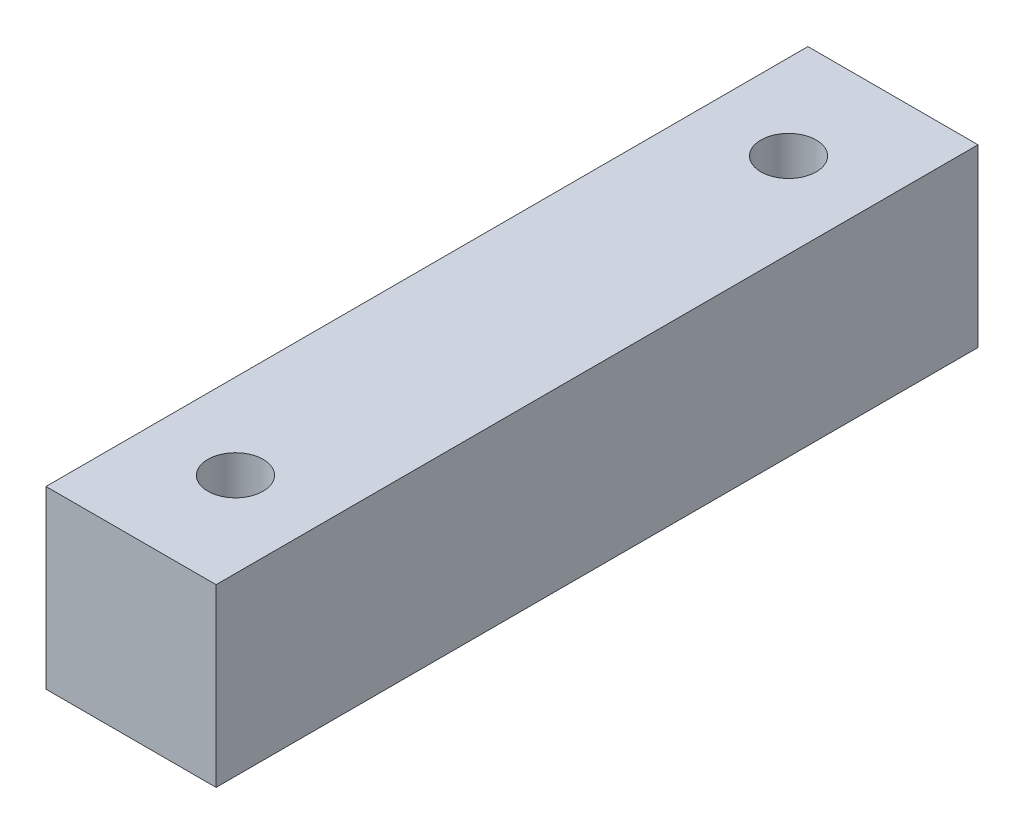
ISO-10303-21;
HEADER;
FILE_DESCRIPTION(('STEP AP214'),'2;1');
FILE_NAME('part.step','',(''),(''),'','','');
FILE_SCHEMA(('AUTOMOTIVE_DESIGN { 1 0 10303 214 1 1 1 1 }'));
ENDSEC;
DATA;
#1=APPLICATION_CONTEXT('core data for automotive mechanical design processes');
#2=APPLICATION_PROTOCOL_DEFINITION('international standard','automotive_design',2000,#1);
#3=PRODUCT_CONTEXT('',#1,'mechanical');
#4=PRODUCT('Part','Part','',(#3));
#5=PRODUCT_RELATED_PRODUCT_CATEGORY('part','',(#4));
#6=PRODUCT_DEFINITION_FORMATION('','',#4);
#7=PRODUCT_DEFINITION_CONTEXT('part definition',#1,'design');
#8=PRODUCT_DEFINITION('design','',#6,#7);
#9=PRODUCT_DEFINITION_SHAPE('','',#8);
#10=(LENGTH_UNIT() NAMED_UNIT(*) SI_UNIT(.MILLI.,.METRE.));
#11=(NAMED_UNIT(*) PLANE_ANGLE_UNIT() SI_UNIT($,.RADIAN.));
#12=(NAMED_UNIT(*) SI_UNIT($,.STERADIAN.) SOLID_ANGLE_UNIT());
#13=UNCERTAINTY_MEASURE_WITH_UNIT(LENGTH_MEASURE(1.E-05),#10,'distance_accuracy_value','');
#14=(GEOMETRIC_REPRESENTATION_CONTEXT(3) GLOBAL_UNCERTAINTY_ASSIGNED_CONTEXT((#13)) GLOBAL_UNIT_ASSIGNED_CONTEXT((#10,
#11,#12)) REPRESENTATION_CONTEXT('',''));
#15=CARTESIAN_POINT('',(0.,0.,0.));
#16=DIRECTION('',(0.,0.,1.));
#17=DIRECTION('',(1.,0.,0.));
#18=AXIS2_PLACEMENT_3D('',#15,#16,#17);
#19=CARTESIAN_POINT('',(-29.0534482758621,12.7,-42.2168103448276));
#20=DIRECTION('',(-1.,0.,0.));
#21=DIRECTION('',(0.,0.,1.));
#22=AXIS2_PLACEMENT_3D('',#19,#20,#21);
#23=PLANE('',#22);
#24=DIRECTION('',(0.,0.,-1.));
#25=VECTOR('',#24,1.);
#26=CARTESIAN_POINT('',(-29.0534482758621,0.,-42.2168103448276));
#27=LINE('',#26,#25);
#28=CARTESIAN_POINT('',(-29.0534482758621,0.,12.8831896551724));
#29=VERTEX_POINT('',#28);
#30=CARTESIAN_POINT('',(-29.0534482758621,0.,-42.2168103448276));
#31=VERTEX_POINT('',#30);
#32=EDGE_CURVE('E110',#29,#31,#27,.T.);
#33=ORIENTED_EDGE('',*,*,#32,.T.);
#34=DIRECTION('',(0.,-1.,0.));
#35=VECTOR('',#34,1.);
#36=CARTESIAN_POINT('',(-29.0534482758621,12.7,-42.2168103448276));
#37=LINE('',#36,#35);
#38=CARTESIAN_POINT('',(-29.0534482758621,12.7,-42.2168103448276));
#39=VERTEX_POINT('',#38);
#40=EDGE_CURVE('E11',#39,#31,#37,.T.);
#41=ORIENTED_EDGE('',*,*,#40,.F.);
#42=DIRECTION('',(0.,0.,-1.));
#43=VECTOR('',#42,1.);
#44=CARTESIAN_POINT('',(-29.0534482758621,12.7,-42.2168103448276));
#45=LINE('',#44,#43);
#46=CARTESIAN_POINT('',(-29.0534482758621,12.7,12.8831896551724));
#47=VERTEX_POINT('',#46);
#48=EDGE_CURVE('E93',#47,#39,#45,.T.);
#49=ORIENTED_EDGE('',*,*,#48,.F.);
#50=DIRECTION('',(0.,-1.,0.));
#51=VECTOR('',#50,1.);
#52=CARTESIAN_POINT('',(-29.0534482758621,12.7,12.8831896551724));
#53=LINE('',#52,#51);
#54=EDGE_CURVE('E106',#47,#29,#53,.T.);
#55=ORIENTED_EDGE('',*,*,#54,.T.);
#56=EDGE_LOOP('',(#33,#41,#49,#55));
#57=FACE_BOUND('',#56,.T.);
#58=ADVANCED_FACE('F39',(#57),#23,.F.);
#59=CARTESIAN_POINT('',(-29.0534482758621,12.7,-42.2168103448276));
#60=DIRECTION('',(0.,0.,1.));
#61=DIRECTION('',(1.,0.,0.));
#62=AXIS2_PLACEMENT_3D('',#59,#60,#61);
#63=PLANE('',#62);
#64=DIRECTION('',(-1.,0.,0.));
#65=VECTOR('',#64,1.);
#66=CARTESIAN_POINT('',(-29.0534482758621,0.,-42.2168103448276));
#67=LINE('',#66,#65);
#68=CARTESIAN_POINT('',(-41.3534482758621,0.,-42.2168103448276));
#69=VERTEX_POINT('',#68);
#70=EDGE_CURVE('E98',#31,#69,#67,.T.);
#71=ORIENTED_EDGE('',*,*,#70,.T.);
#72=DIRECTION('',(0.,-1.,0.));
#73=VECTOR('',#72,1.);
#74=CARTESIAN_POINT('',(-41.3534482758621,12.7,-42.2168103448276));
#75=LINE('',#74,#73);
#76=CARTESIAN_POINT('',(-41.3534482758621,12.7,-42.2168103448276));
#77=VERTEX_POINT('',#76);
#78=EDGE_CURVE('E49',#77,#69,#75,.T.);
#79=ORIENTED_EDGE('',*,*,#78,.F.);
#80=DIRECTION('',(-1.,0.,0.));
#81=VECTOR('',#80,1.);
#82=CARTESIAN_POINT('',(-29.0534482758621,12.7,-42.2168103448276));
#83=LINE('',#82,#81);
#84=EDGE_CURVE('E88',#39,#77,#83,.T.);
#85=ORIENTED_EDGE('',*,*,#84,.F.);
#86=ORIENTED_EDGE('',*,*,#40,.T.);
#87=EDGE_LOOP('',(#71,#79,#85,#86));
#88=FACE_BOUND('',#87,.T.);
#89=ADVANCED_FACE('F97',(#88),#63,.F.);
#90=CARTESIAN_POINT('',(-41.3534482758621,12.7,-42.2168103448276));
#91=DIRECTION('',(1.,0.,0.));
#92=DIRECTION('',(0.,0.,-1.));
#93=AXIS2_PLACEMENT_3D('',#90,#91,#92);
#94=PLANE('',#93);
#95=DIRECTION('',(0.,0.,1.));
#96=VECTOR('',#95,1.);
#97=CARTESIAN_POINT('',(-41.3534482758621,0.,-42.2168103448276));
#98=LINE('',#97,#96);
#99=CARTESIAN_POINT('',(-41.3534482758621,0.,12.8831896551724));
#100=VERTEX_POINT('',#99);
#101=EDGE_CURVE('E75',#69,#100,#98,.T.);
#102=ORIENTED_EDGE('',*,*,#101,.T.);
#103=DIRECTION('',(0.,-1.,0.));
#104=VECTOR('',#103,1.);
#105=CARTESIAN_POINT('',(-41.3534482758621,12.7,12.8831896551724));
#106=LINE('',#105,#104);
#107=CARTESIAN_POINT('',(-41.3534482758621,12.7,12.8831896551724));
#108=VERTEX_POINT('',#107);
#109=EDGE_CURVE('E100',#108,#100,#106,.T.);
#110=ORIENTED_EDGE('',*,*,#109,.F.);
#111=DIRECTION('',(0.,0.,1.));
#112=VECTOR('',#111,1.);
#113=CARTESIAN_POINT('',(-41.3534482758621,12.7,-42.2168103448276));
#114=LINE('',#113,#112);
#115=EDGE_CURVE('E91',#77,#108,#114,.T.);
#116=ORIENTED_EDGE('',*,*,#115,.F.);
#117=ORIENTED_EDGE('',*,*,#78,.T.);
#118=EDGE_LOOP('',(#102,#110,#116,#117));
#119=FACE_BOUND('',#118,.T.);
#120=ADVANCED_FACE('F102',(#119),#94,.F.);
#121=CARTESIAN_POINT('',(-29.0534482758621,12.7,12.8831896551724));
#122=DIRECTION('',(0.,0.,-1.));
#123=DIRECTION('',(-1.,0.,0.));
#124=AXIS2_PLACEMENT_3D('',#121,#122,#123);
#125=PLANE('',#124);
#126=DIRECTION('',(1.,0.,0.));
#127=VECTOR('',#126,1.);
#128=CARTESIAN_POINT('',(-29.0534482758621,0.,12.8831896551724));
#129=LINE('',#128,#127);
#130=EDGE_CURVE('E81',#100,#29,#129,.T.);
#131=ORIENTED_EDGE('',*,*,#130,.T.);
#132=ORIENTED_EDGE('',*,*,#54,.F.);
#133=DIRECTION('',(1.,0.,0.));
#134=VECTOR('',#133,1.);
#135=CARTESIAN_POINT('',(-29.0534482758621,12.7,12.8831896551724));
#136=LINE('',#135,#134);
#137=EDGE_CURVE('E58',#108,#47,#136,.T.);
#138=ORIENTED_EDGE('',*,*,#137,.F.);
#139=ORIENTED_EDGE('',*,*,#109,.T.);
#140=EDGE_LOOP('',(#131,#132,#138,#139));
#141=FACE_BOUND('',#140,.T.);
#142=ADVANCED_FACE('F147',(#141),#125,.F.);
#143=CARTESIAN_POINT('',(0.,12.7,0.));
#144=DIRECTION('',(0.,-1.,0.));
#145=DIRECTION('',(0.,0.,-1.));
#146=AXIS2_PLACEMENT_3D('',#143,#144,#145);
#147=PLANE('',#146);
#148=CARTESIAN_POINT('',(-35.2034482758621,12.7,-34.6668103448276));
#149=DIRECTION('',(0.,1.,0.));
#150=DIRECTION('',(0.,0.,1.));
#151=AXIS2_PLACEMENT_3D('',#148,#149,#150);
#152=CIRCLE('',#151,2.);
#153=CARTESIAN_POINT('',(-35.2034482758621,12.7,-32.6668103448276));
#154=VERTEX_POINT('',#153);
#155=EDGE_CURVE('E126',#154,#154,#152,.T.);
#156=ORIENTED_EDGE('',*,*,#155,.F.);
#157=EDGE_LOOP('',(#156));
#158=FACE_BOUND('',#157,.T.);
#159=CARTESIAN_POINT('',(-35.2034482758621,12.7,5.33318965517243));
#160=DIRECTION('',(0.,1.,0.));
#161=DIRECTION('',(0.,0.,1.));
#162=AXIS2_PLACEMENT_3D('',#159,#160,#161);
#163=CIRCLE('',#162,2.);
#164=CARTESIAN_POINT('',(-35.2034482758621,12.7,7.33318965517244));
#165=VERTEX_POINT('',#164);
#166=EDGE_CURVE('E133',#165,#165,#163,.T.);
#167=ORIENTED_EDGE('',*,*,#166,.F.);
#168=EDGE_LOOP('',(#167));
#169=FACE_BOUND('',#168,.T.);
#170=ORIENTED_EDGE('',*,*,#48,.T.);
#171=ORIENTED_EDGE('',*,*,#84,.T.);
#172=ORIENTED_EDGE('',*,*,#115,.T.);
#173=ORIENTED_EDGE('',*,*,#137,.T.);
#174=EDGE_LOOP('',(#170,#171,#172,#173));
#175=FACE_BOUND('',#174,.T.);
#176=ADVANCED_FACE('F89',(#158,#169,#175),#147,.F.);
#177=CARTESIAN_POINT('',(0.,0.,0.));
#178=DIRECTION('',(0.,-1.,0.));
#179=DIRECTION('',(0.,0.,-1.));
#180=AXIS2_PLACEMENT_3D('',#177,#178,#179);
#181=PLANE('',#180);
#182=CARTESIAN_POINT('',(-35.2034482758621,0.,-34.6668103448276));
#183=DIRECTION('',(0.,-1.,0.));
#184=DIRECTION('',(0.,0.,-1.));
#185=AXIS2_PLACEMENT_3D('',#182,#183,#184);
#186=CIRCLE('',#185,2.);
#187=CARTESIAN_POINT('',(-35.2034482758621,0.,-36.6668103448276));
#188=VERTEX_POINT('',#187);
#189=EDGE_CURVE('E42',#188,#188,#186,.T.);
#190=ORIENTED_EDGE('',*,*,#189,.F.);
#191=EDGE_LOOP('',(#190));
#192=FACE_BOUND('',#191,.T.);
#193=CARTESIAN_POINT('',(-35.2034482758621,0.,5.33318965517243));
#194=DIRECTION('',(0.,-1.,0.));
#195=DIRECTION('',(0.,0.,-1.));
#196=AXIS2_PLACEMENT_3D('',#193,#194,#195);
#197=CIRCLE('',#196,2.);
#198=CARTESIAN_POINT('',(-35.2034482758621,0.,3.33318965517243));
#199=VERTEX_POINT('',#198);
#200=EDGE_CURVE('E123',#199,#199,#197,.T.);
#201=ORIENTED_EDGE('',*,*,#200,.F.);
#202=EDGE_LOOP('',(#201));
#203=FACE_BOUND('',#202,.T.);
#204=ORIENTED_EDGE('',*,*,#32,.F.);
#205=ORIENTED_EDGE('',*,*,#130,.F.);
#206=ORIENTED_EDGE('',*,*,#101,.F.);
#207=ORIENTED_EDGE('',*,*,#70,.F.);
#208=EDGE_LOOP('',(#204,#205,#206,#207));
#209=FACE_BOUND('',#208,.T.);
#210=ADVANCED_FACE('F146',(#192,#203,#209),#181,.T.);
#211=CARTESIAN_POINT('',(-35.2034482758621,-1.3,5.33318965517243));
#212=DIRECTION('',(0.,1.,0.));
#213=DIRECTION('',(0.,0.,1.));
#214=AXIS2_PLACEMENT_3D('',#211,#212,#213);
#215=CYLINDRICAL_SURFACE('',#214,2.);
#216=ORIENTED_EDGE('',*,*,#200,.T.);
#217=EDGE_LOOP('',(#216));
#218=FACE_BOUND('',#217,.T.);
#219=ORIENTED_EDGE('',*,*,#166,.T.);
#220=EDGE_LOOP('',(#219));
#221=FACE_BOUND('',#220,.T.);
#222=ADVANCED_FACE('F143',(#218,#221),#215,.F.);
#223=CARTESIAN_POINT('',(-35.2034482758621,-1.3,-34.6668103448276));
#224=DIRECTION('',(0.,1.,0.));
#225=DIRECTION('',(0.,0.,1.));
#226=AXIS2_PLACEMENT_3D('',#223,#224,#225);
#227=CYLINDRICAL_SURFACE('',#226,2.);
#228=ORIENTED_EDGE('',*,*,#189,.T.);
#229=EDGE_LOOP('',(#228));
#230=FACE_BOUND('',#229,.T.);
#231=ORIENTED_EDGE('',*,*,#155,.T.);
#232=EDGE_LOOP('',(#231));
#233=FACE_BOUND('',#232,.T.);
#234=ADVANCED_FACE('F194',(#230,#233),#227,.F.);
#235=CLOSED_SHELL('',(#58,#89,#120,#142,#176,#210,#222,#234));
#236=MANIFOLD_SOLID_BREP('B2',#235);
#237=ADVANCED_BREP_SHAPE_REPRESENTATION('',(#18,#236),#14);
#238=SHAPE_DEFINITION_REPRESENTATION(#9,#237);
ENDSEC;
END-ISO-10303-21;
